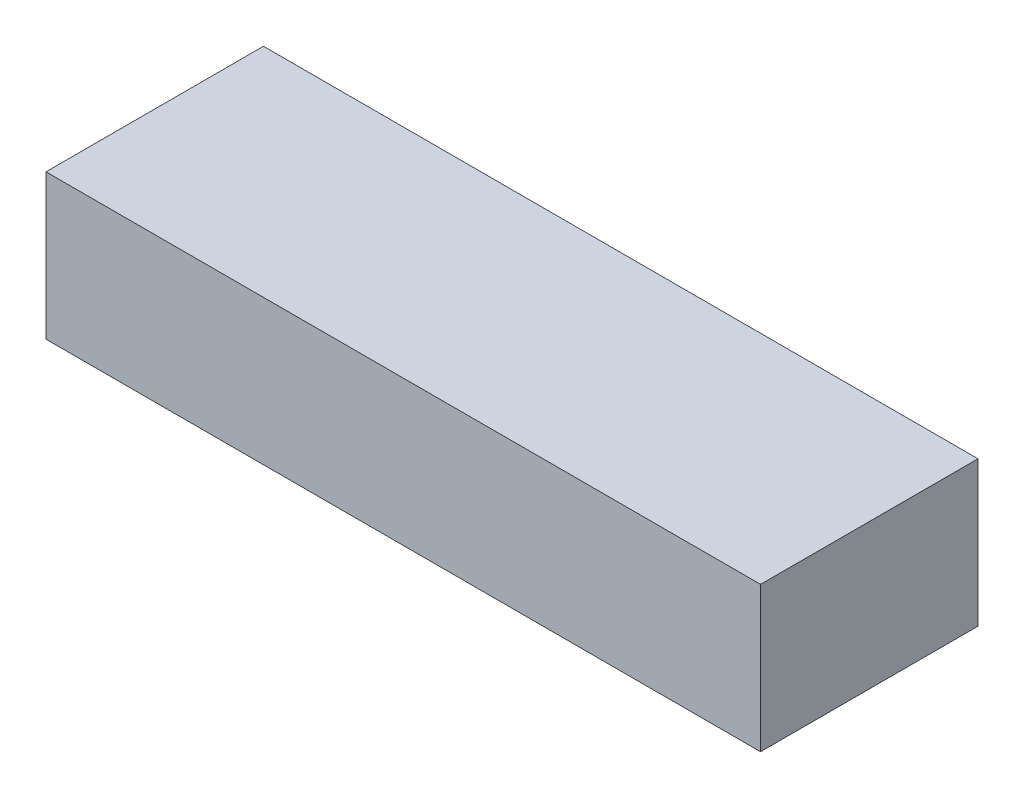
ISO-10303-21;
HEADER;
FILE_DESCRIPTION(('STEP AP214'),'2;1');
FILE_NAME('part.step','',(''),(''),'','','');
FILE_SCHEMA(('AUTOMOTIVE_DESIGN { 1 0 10303 214 1 1 1 1 }'));
ENDSEC;
DATA;
#1=APPLICATION_CONTEXT('core data for automotive mechanical design processes');
#2=APPLICATION_PROTOCOL_DEFINITION('international standard','automotive_design',2000,#1);
#3=PRODUCT_CONTEXT('',#1,'mechanical');
#4=PRODUCT('Part','Part','',(#3));
#5=PRODUCT_RELATED_PRODUCT_CATEGORY('part','',(#4));
#6=PRODUCT_DEFINITION_FORMATION('','',#4);
#7=PRODUCT_DEFINITION_CONTEXT('part definition',#1,'design');
#8=PRODUCT_DEFINITION('design','',#6,#7);
#9=PRODUCT_DEFINITION_SHAPE('','',#8);
#10=(LENGTH_UNIT() NAMED_UNIT(*) SI_UNIT(.MILLI.,.METRE.));
#11=(NAMED_UNIT(*) PLANE_ANGLE_UNIT() SI_UNIT($,.RADIAN.));
#12=(NAMED_UNIT(*) SI_UNIT($,.STERADIAN.) SOLID_ANGLE_UNIT());
#13=UNCERTAINTY_MEASURE_WITH_UNIT(LENGTH_MEASURE(1.E-05),#10,'distance_accuracy_value','');
#14=(GEOMETRIC_REPRESENTATION_CONTEXT(3) GLOBAL_UNCERTAINTY_ASSIGNED_CONTEXT((#13)) GLOBAL_UNIT_ASSIGNED_CONTEXT((#10,
#11,#12)) REPRESENTATION_CONTEXT('',''));
#15=CARTESIAN_POINT('',(0.,0.,0.));
#16=DIRECTION('',(0.,0.,1.));
#17=DIRECTION('',(1.,0.,0.));
#18=AXIS2_PLACEMENT_3D('',#15,#16,#17);
#19=CARTESIAN_POINT('',(69.,28.,21.));
#20=DIRECTION('',(-1.,0.,0.));
#21=DIRECTION('',(0.,0.,1.));
#22=AXIS2_PLACEMENT_3D('',#19,#20,#21);
#23=PLANE('',#22);
#24=DIRECTION('',(0.,0.,-1.));
#25=VECTOR('',#24,1.);
#26=CARTESIAN_POINT('',(69.,0.,21.));
#27=LINE('',#26,#25);
#28=CARTESIAN_POINT('',(69.,0.,21.));
#29=VERTEX_POINT('',#28);
#30=CARTESIAN_POINT('',(69.,0.,-21.));
#31=VERTEX_POINT('',#30);
#32=EDGE_CURVE('E145',#29,#31,#27,.T.);
#33=ORIENTED_EDGE('',*,*,#32,.T.);
#34=DIRECTION('',(0.,-1.,0.));
#35=VECTOR('',#34,1.);
#36=CARTESIAN_POINT('',(69.,28.,-21.));
#37=LINE('',#36,#35);
#38=CARTESIAN_POINT('',(69.,28.,-21.));
#39=VERTEX_POINT('',#38);
#40=EDGE_CURVE('E11',#39,#31,#37,.T.);
#41=ORIENTED_EDGE('',*,*,#40,.F.);
#42=DIRECTION('',(0.,0.,-1.));
#43=VECTOR('',#42,1.);
#44=CARTESIAN_POINT('',(69.,28.,21.));
#45=LINE('',#44,#43);
#46=CARTESIAN_POINT('',(69.,28.,21.));
#47=VERTEX_POINT('',#46);
#48=EDGE_CURVE('E138',#47,#39,#45,.T.);
#49=ORIENTED_EDGE('',*,*,#48,.F.);
#50=DIRECTION('',(0.,-1.,0.));
#51=VECTOR('',#50,1.);
#52=CARTESIAN_POINT('',(69.,28.,21.));
#53=LINE('',#52,#51);
#54=EDGE_CURVE('E144',#47,#29,#53,.T.);
#55=ORIENTED_EDGE('',*,*,#54,.T.);
#56=EDGE_LOOP('',(#33,#41,#49,#55));
#57=FACE_BOUND('',#56,.T.);
#58=ADVANCED_FACE('F33',(#57),#23,.F.);
#59=CARTESIAN_POINT('',(-69.,28.,-21.));
#60=DIRECTION('',(0.,0.,1.));
#61=DIRECTION('',(1.,0.,0.));
#62=AXIS2_PLACEMENT_3D('',#59,#60,#61);
#63=PLANE('',#62);
#64=DIRECTION('',(-1.,0.,0.));
#65=VECTOR('',#64,1.);
#66=CARTESIAN_POINT('',(-69.,0.,-21.));
#67=LINE('',#66,#65);
#68=CARTESIAN_POINT('',(-69.,0.,-21.));
#69=VERTEX_POINT('',#68);
#70=EDGE_CURVE('E148',#31,#69,#67,.T.);
#71=ORIENTED_EDGE('',*,*,#70,.T.);
#72=DIRECTION('',(0.,-1.,0.));
#73=VECTOR('',#72,1.);
#74=CARTESIAN_POINT('',(-69.,28.,-21.));
#75=LINE('',#74,#73);
#76=CARTESIAN_POINT('',(-69.,28.,-21.));
#77=VERTEX_POINT('',#76);
#78=EDGE_CURVE('E40',#77,#69,#75,.T.);
#79=ORIENTED_EDGE('',*,*,#78,.F.);
#80=DIRECTION('',(-1.,0.,0.));
#81=VECTOR('',#80,1.);
#82=CARTESIAN_POINT('',(-69.,28.,-21.));
#83=LINE('',#82,#81);
#84=EDGE_CURVE('E84',#39,#77,#83,.T.);
#85=ORIENTED_EDGE('',*,*,#84,.F.);
#86=ORIENTED_EDGE('',*,*,#40,.T.);
#87=EDGE_LOOP('',(#71,#79,#85,#86));
#88=FACE_BOUND('',#87,.T.);
#89=ADVANCED_FACE('F174',(#88),#63,.F.);
#90=CARTESIAN_POINT('',(-69.,28.,21.));
#91=DIRECTION('',(1.,0.,0.));
#92=DIRECTION('',(0.,0.,-1.));
#93=AXIS2_PLACEMENT_3D('',#90,#91,#92);
#94=PLANE('',#93);
#95=DIRECTION('',(0.,0.,1.));
#96=VECTOR('',#95,1.);
#97=CARTESIAN_POINT('',(-69.,0.,21.));
#98=LINE('',#97,#96);
#99=CARTESIAN_POINT('',(-69.,0.,21.));
#100=VERTEX_POINT('',#99);
#101=EDGE_CURVE('E150',#69,#100,#98,.T.);
#102=ORIENTED_EDGE('',*,*,#101,.T.);
#103=DIRECTION('',(0.,-1.,0.));
#104=VECTOR('',#103,1.);
#105=CARTESIAN_POINT('',(-69.,28.,21.));
#106=LINE('',#105,#104);
#107=CARTESIAN_POINT('',(-69.,28.,21.));
#108=VERTEX_POINT('',#107);
#109=EDGE_CURVE('E154',#108,#100,#106,.T.);
#110=ORIENTED_EDGE('',*,*,#109,.F.);
#111=DIRECTION('',(0.,0.,1.));
#112=VECTOR('',#111,1.);
#113=CARTESIAN_POINT('',(-69.,28.,21.));
#114=LINE('',#113,#112);
#115=EDGE_CURVE('E141',#77,#108,#114,.T.);
#116=ORIENTED_EDGE('',*,*,#115,.F.);
#117=ORIENTED_EDGE('',*,*,#78,.T.);
#118=EDGE_LOOP('',(#102,#110,#116,#117));
#119=FACE_BOUND('',#118,.T.);
#120=ADVANCED_FACE('F159',(#119),#94,.F.);
#121=CARTESIAN_POINT('',(-69.,28.,21.));
#122=DIRECTION('',(0.,0.,-1.));
#123=DIRECTION('',(-1.,0.,0.));
#124=AXIS2_PLACEMENT_3D('',#121,#122,#123);
#125=PLANE('',#124);
#126=DIRECTION('',(1.,0.,0.));
#127=VECTOR('',#126,1.);
#128=CARTESIAN_POINT('',(-69.,0.,21.));
#129=LINE('',#128,#127);
#130=EDGE_CURVE('E77',#100,#29,#129,.T.);
#131=ORIENTED_EDGE('',*,*,#130,.T.);
#132=ORIENTED_EDGE('',*,*,#54,.F.);
#133=DIRECTION('',(1.,0.,0.));
#134=VECTOR('',#133,1.);
#135=CARTESIAN_POINT('',(-69.,28.,21.));
#136=LINE('',#135,#134);
#137=EDGE_CURVE('E56',#108,#47,#136,.T.);
#138=ORIENTED_EDGE('',*,*,#137,.F.);
#139=ORIENTED_EDGE('',*,*,#109,.T.);
#140=EDGE_LOOP('',(#131,#132,#138,#139));
#141=FACE_BOUND('',#140,.T.);
#142=ADVANCED_FACE('F165',(#141),#125,.F.);
#143=CARTESIAN_POINT('',(0.,28.,0.));
#144=DIRECTION('',(0.,-1.,0.));
#145=DIRECTION('',(0.,0.,-1.));
#146=AXIS2_PLACEMENT_3D('',#143,#144,#145);
#147=PLANE('',#146);
#148=ORIENTED_EDGE('',*,*,#48,.T.);
#149=ORIENTED_EDGE('',*,*,#84,.T.);
#150=ORIENTED_EDGE('',*,*,#115,.T.);
#151=ORIENTED_EDGE('',*,*,#137,.T.);
#152=EDGE_LOOP('',(#148,#149,#150,#151));
#153=FACE_BOUND('',#152,.T.);
#154=ADVANCED_FACE('F167',(#153),#147,.F.);
#155=CARTESIAN_POINT('',(0.,0.,0.));
#156=DIRECTION('',(0.,-1.,0.));
#157=DIRECTION('',(0.,0.,-1.));
#158=AXIS2_PLACEMENT_3D('',#155,#156,#157);
#159=PLANE('',#158);
#160=DIRECTION('',(0.,0.,1.));
#161=VECTOR('',#160,1.);
#162=CARTESIAN_POINT('',(55.,0.,-9.99999999999994));
#163=LINE('',#162,#161);
#164=CARTESIAN_POINT('',(55.,0.,-9.99999999999994));
#165=VERTEX_POINT('',#164);
#166=CARTESIAN_POINT('',(55.,0.,10.));
#167=VERTEX_POINT('',#166);
#168=EDGE_CURVE('E47',#165,#167,#163,.T.);
#169=ORIENTED_EDGE('',*,*,#168,.F.);
#170=DIRECTION('',(1.,0.,0.));
#171=VECTOR('',#170,1.);
#172=CARTESIAN_POINT('',(-50.,0.,-9.99999999999994));
#173=LINE('',#172,#171);
#174=CARTESIAN_POINT('',(-50.,0.,-9.99999999999994));
#175=VERTEX_POINT('',#174);
#176=EDGE_CURVE('E124',#175,#165,#173,.T.);
#177=ORIENTED_EDGE('',*,*,#176,.F.);
#178=DIRECTION('',(0.,0.,1.));
#179=VECTOR('',#178,1.);
#180=CARTESIAN_POINT('',(-50.,0.,-9.99999999999994));
#181=LINE('',#180,#179);
#182=CARTESIAN_POINT('',(-50.,0.,10.));
#183=VERTEX_POINT('',#182);
#184=EDGE_CURVE('E109',#175,#183,#181,.T.);
#185=ORIENTED_EDGE('',*,*,#184,.T.);
#186=DIRECTION('',(1.,0.,0.));
#187=VECTOR('',#186,1.);
#188=CARTESIAN_POINT('',(-50.,0.,10.));
#189=LINE('',#188,#187);
#190=EDGE_CURVE('E130',#183,#167,#189,.T.);
#191=ORIENTED_EDGE('',*,*,#190,.T.);
#192=EDGE_LOOP('',(#169,#177,#185,#191));
#193=FACE_BOUND('',#192,.T.);
#194=ORIENTED_EDGE('',*,*,#32,.F.);
#195=ORIENTED_EDGE('',*,*,#130,.F.);
#196=ORIENTED_EDGE('',*,*,#101,.F.);
#197=ORIENTED_EDGE('',*,*,#70,.F.);
#198=EDGE_LOOP('',(#194,#195,#196,#197));
#199=FACE_BOUND('',#198,.T.);
#200=ADVANCED_FACE('F128',(#193,#199),#159,.T.);
#201=CARTESIAN_POINT('',(-50.,-4.99999999999999,-15.));
#202=DIRECTION('',(0.,0.707106781186552,-0.707106781186543));
#203=DIRECTION('',(0.,0.707106781186543,0.707106781186552));
#204=AXIS2_PLACEMENT_3D('',#201,#202,#203);
#205=PLANE('',#204);
#206=DIRECTION('',(0.,0.707106781186543,0.707106781186552));
#207=VECTOR('',#206,1.);
#208=CARTESIAN_POINT('',(55.,-4.99999999999999,-15.));
#209=LINE('',#208,#207);
#210=CARTESIAN_POINT('',(55.,-4.99999999999999,-15.));
#211=VERTEX_POINT('',#210);
#212=EDGE_CURVE('E252',#211,#165,#209,.T.);
#213=ORIENTED_EDGE('',*,*,#212,.F.);
#214=DIRECTION('',(1.,0.,0.));
#215=VECTOR('',#214,1.);
#216=CARTESIAN_POINT('',(-50.,-4.99999999999999,-15.));
#217=LINE('',#216,#215);
#218=CARTESIAN_POINT('',(-50.,-4.99999999999999,-15.));
#219=VERTEX_POINT('',#218);
#220=EDGE_CURVE('E125',#219,#211,#217,.T.);
#221=ORIENTED_EDGE('',*,*,#220,.F.);
#222=DIRECTION('',(0.,0.707106781186543,0.707106781186552));
#223=VECTOR('',#222,1.);
#224=CARTESIAN_POINT('',(-50.,-4.99999999999999,-15.));
#225=LINE('',#224,#223);
#226=EDGE_CURVE('E113',#219,#175,#225,.T.);
#227=ORIENTED_EDGE('',*,*,#226,.T.);
#228=ORIENTED_EDGE('',*,*,#176,.T.);
#229=EDGE_LOOP('',(#213,#221,#227,#228));
#230=FACE_BOUND('',#229,.T.);
#231=ADVANCED_FACE('F123',(#230),#205,.T.);
#232=CARTESIAN_POINT('',(-50.,-5.,15.));
#233=DIRECTION('',(0.,-1.,0.));
#234=DIRECTION('',(0.,0.,-1.));
#235=AXIS2_PLACEMENT_3D('',#232,#233,#234);
#236=PLANE('',#235);
#237=DIRECTION('',(0.,0.,-1.));
#238=VECTOR('',#237,1.);
#239=CARTESIAN_POINT('',(55.,-5.,15.));
#240=LINE('',#239,#238);
#241=CARTESIAN_POINT('',(55.,-5.,15.));
#242=VERTEX_POINT('',#241);
#243=EDGE_CURVE('E126',#242,#211,#240,.T.);
#244=ORIENTED_EDGE('',*,*,#243,.F.);
#245=DIRECTION('',(1.,0.,0.));
#246=VECTOR('',#245,1.);
#247=CARTESIAN_POINT('',(-50.,-5.,15.));
#248=LINE('',#247,#246);
#249=CARTESIAN_POINT('',(-50.,-5.,15.));
#250=VERTEX_POINT('',#249);
#251=EDGE_CURVE('E133',#250,#242,#248,.T.);
#252=ORIENTED_EDGE('',*,*,#251,.F.);
#253=DIRECTION('',(0.,0.,-1.));
#254=VECTOR('',#253,1.);
#255=CARTESIAN_POINT('',(-50.,-5.,15.));
#256=LINE('',#255,#254);
#257=EDGE_CURVE('E131',#250,#219,#256,.T.);
#258=ORIENTED_EDGE('',*,*,#257,.T.);
#259=ORIENTED_EDGE('',*,*,#220,.T.);
#260=EDGE_LOOP('',(#244,#252,#258,#259));
#261=FACE_BOUND('',#260,.T.);
#262=ADVANCED_FACE('F211',(#261),#236,.T.);
#263=CARTESIAN_POINT('',(-50.,-5.,15.));
#264=DIRECTION('',(0.,0.707106781186546,0.707106781186549));
#265=DIRECTION('',(0.,-0.707106781186549,0.707106781186546));
#266=AXIS2_PLACEMENT_3D('',#263,#264,#265);
#267=PLANE('',#266);
#268=DIRECTION('',(0.,-0.707106781186549,0.707106781186546));
#269=VECTOR('',#268,1.);
#270=CARTESIAN_POINT('',(55.,-5.,15.));
#271=LINE('',#270,#269);
#272=EDGE_CURVE('E255',#167,#242,#271,.T.);
#273=ORIENTED_EDGE('',*,*,#272,.F.);
#274=ORIENTED_EDGE('',*,*,#190,.F.);
#275=DIRECTION('',(0.,-0.707106781186549,0.707106781186546));
#276=VECTOR('',#275,1.);
#277=CARTESIAN_POINT('',(-50.,-5.,15.));
#278=LINE('',#277,#276);
#279=EDGE_CURVE('E116',#183,#250,#278,.T.);
#280=ORIENTED_EDGE('',*,*,#279,.T.);
#281=ORIENTED_EDGE('',*,*,#251,.T.);
#282=EDGE_LOOP('',(#273,#274,#280,#281));
#283=FACE_BOUND('',#282,.T.);
#284=ADVANCED_FACE('F220',(#283),#267,.T.);
#285=CARTESIAN_POINT('',(-50.,0.,0.));
#286=DIRECTION('',(-1.,0.,0.));
#287=DIRECTION('',(0.,0.,1.));
#288=AXIS2_PLACEMENT_3D('',#285,#286,#287);
#289=PLANE('',#288);
#290=ORIENTED_EDGE('',*,*,#226,.F.);
#291=ORIENTED_EDGE('',*,*,#257,.F.);
#292=ORIENTED_EDGE('',*,*,#279,.F.);
#293=ORIENTED_EDGE('',*,*,#184,.F.);
#294=EDGE_LOOP('',(#290,#291,#292,#293));
#295=FACE_BOUND('',#294,.T.);
#296=ADVANCED_FACE('F111',(#295),#289,.T.);
#297=CARTESIAN_POINT('',(55.,0.,0.));
#298=DIRECTION('',(-1.,0.,0.));
#299=DIRECTION('',(0.,0.,1.));
#300=AXIS2_PLACEMENT_3D('',#297,#298,#299);
#301=PLANE('',#300);
#302=ORIENTED_EDGE('',*,*,#212,.T.);
#303=ORIENTED_EDGE('',*,*,#168,.T.);
#304=ORIENTED_EDGE('',*,*,#272,.T.);
#305=ORIENTED_EDGE('',*,*,#243,.T.);
#306=EDGE_LOOP('',(#302,#303,#304,#305));
#307=FACE_BOUND('',#306,.T.);
#308=ADVANCED_FACE('F239',(#307),#301,.F.);
#309=CLOSED_SHELL('',(#58,#89,#120,#142,#154,#200,#231,#262,#284,#296,#308));
#310=MANIFOLD_SOLID_BREP('B2',#309);
#311=ADVANCED_BREP_SHAPE_REPRESENTATION('',(#18,#310),#14);
#312=SHAPE_DEFINITION_REPRESENTATION(#9,#311);
ENDSEC;
END-ISO-10303-21;
